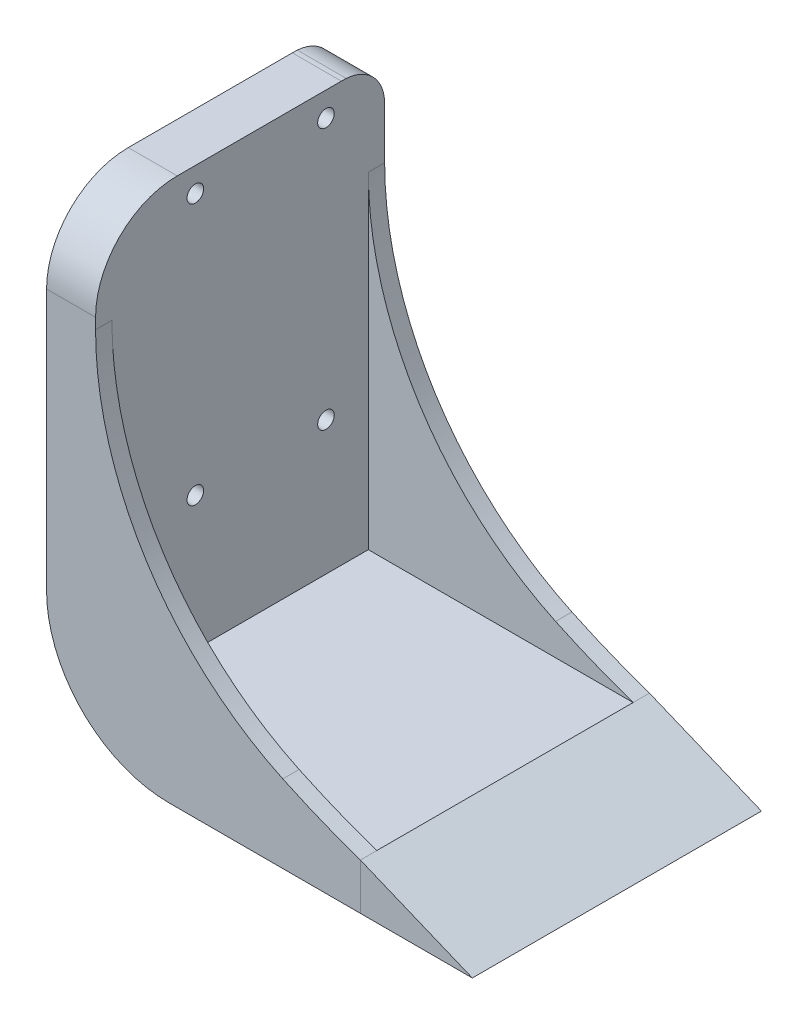
ISO-10303-21;
HEADER;
FILE_DESCRIPTION(('STEP AP214'),'2;1');
FILE_NAME('part.step','',(''),(''),'','','');
FILE_SCHEMA(('AUTOMOTIVE_DESIGN { 1 0 10303 214 1 1 1 1 }'));
ENDSEC;
DATA;
#1=APPLICATION_CONTEXT('core data for automotive mechanical design processes');
#2=APPLICATION_PROTOCOL_DEFINITION('international standard','automotive_design',2000,#1);
#3=PRODUCT_CONTEXT('',#1,'mechanical');
#4=PRODUCT('Part','Part','',(#3));
#5=PRODUCT_RELATED_PRODUCT_CATEGORY('part','',(#4));
#6=PRODUCT_DEFINITION_FORMATION('','',#4);
#7=PRODUCT_DEFINITION_CONTEXT('part definition',#1,'design');
#8=PRODUCT_DEFINITION('design','',#6,#7);
#9=PRODUCT_DEFINITION_SHAPE('','',#8);
#10=(LENGTH_UNIT() NAMED_UNIT(*) SI_UNIT(.MILLI.,.METRE.));
#11=(NAMED_UNIT(*) PLANE_ANGLE_UNIT() SI_UNIT($,.RADIAN.));
#12=(NAMED_UNIT(*) SI_UNIT($,.STERADIAN.) SOLID_ANGLE_UNIT());
#13=UNCERTAINTY_MEASURE_WITH_UNIT(LENGTH_MEASURE(1.E-05),#10,'distance_accuracy_value','');
#14=(GEOMETRIC_REPRESENTATION_CONTEXT(3) GLOBAL_UNCERTAINTY_ASSIGNED_CONTEXT((#13)) GLOBAL_UNIT_ASSIGNED_CONTEXT((#10,
#11,#12)) REPRESENTATION_CONTEXT('',''));
#15=CARTESIAN_POINT('',(0.,0.,0.));
#16=DIRECTION('',(0.,0.,1.));
#17=DIRECTION('',(1.,0.,0.));
#18=AXIS2_PLACEMENT_3D('',#15,#16,#17);
#19=CARTESIAN_POINT('',(38.4306769759206,14.1550631014392,0.0950000000000048));
#20=DIRECTION('',(-1.,0.,0.));
#21=DIRECTION('',(0.,0.,1.));
#22=AXIS2_PLACEMENT_3D('',#19,#20,#21);
#23=PLANE('',#22);
#24=DIRECTION('',(0.,0.,1.));
#25=VECTOR('',#24,1.);
#26=CARTESIAN_POINT('',(38.4306769759206,14.1550631014392,0.0950000000000048));
#27=LINE('',#26,#25);
#28=CARTESIAN_POINT('',(38.4306769759206,14.1550631014392,4.69256326405334));
#29=VERTEX_POINT('',#28);
#30=CARTESIAN_POINT('',(38.4306769759206,14.1550631014392,40.1));
#31=VERTEX_POINT('',#30);
#32=EDGE_CURVE('E12',#29,#31,#27,.T.);
#33=ORIENTED_EDGE('',*,*,#32,.F.);
#34=DIRECTION('',(0.,-1.,0.));
#35=VECTOR('',#34,1.);
#36=CARTESIAN_POINT('',(38.4306769759206,14.1550631014392,4.69256326405334));
#37=LINE('',#36,#35);
#38=CARTESIAN_POINT('',(38.4306769759206,8.49999999999999,4.69256326405334));
#39=VERTEX_POINT('',#38);
#40=EDGE_CURVE('E79',#29,#39,#37,.T.);
#41=ORIENTED_EDGE('',*,*,#40,.T.);
#42=DIRECTION('',(0.,0.,1.));
#43=VECTOR('',#42,1.);
#44=CARTESIAN_POINT('',(38.4306769759206,8.5,0.0950000000000048));
#45=LINE('',#44,#43);
#46=CARTESIAN_POINT('',(38.4306769759206,8.5,40.1));
#47=VERTEX_POINT('',#46);
#48=EDGE_CURVE('E47',#39,#47,#45,.T.);
#49=ORIENTED_EDGE('',*,*,#48,.T.);
#50=DIRECTION('',(0.,-1.,0.));
#51=VECTOR('',#50,1.);
#52=CARTESIAN_POINT('',(38.4306769759206,14.1550631014392,40.1));
#53=LINE('',#52,#51);
#54=EDGE_CURVE('E86',#31,#47,#53,.T.);
#55=ORIENTED_EDGE('',*,*,#54,.F.);
#56=EDGE_LOOP('',(#33,#41,#49,#55));
#57=FACE_BOUND('',#56,.T.);
#58=ADVANCED_FACE('F44',(#57),#23,.T.);
#59=CARTESIAN_POINT('',(52.1466769759206,8.5,0.0950000000000048));
#60=DIRECTION('',(0.381170386169912,0.924504806210914,0.));
#61=DIRECTION('',(-0.924504806210914,0.381170386169913,0.));
#62=AXIS2_PLACEMENT_3D('',#59,#60,#61);
#63=PLANE('',#62);
#64=DIRECTION('',(0.,0.,1.));
#65=VECTOR('',#64,1.);
#66=CARTESIAN_POINT('',(52.1466769759206,8.5,0.0950000000000048));
#67=LINE('',#66,#65);
#68=CARTESIAN_POINT('',(52.1466769759206,8.5,4.69256326405334));
#69=VERTEX_POINT('',#68);
#70=CARTESIAN_POINT('',(52.1466769759206,8.5,40.1));
#71=VERTEX_POINT('',#70);
#72=EDGE_CURVE('E52',#69,#71,#67,.T.);
#73=ORIENTED_EDGE('',*,*,#72,.F.);
#74=DIRECTION('',(-0.924504806210914,0.381170386169913,0.));
#75=VECTOR('',#74,1.);
#76=CARTESIAN_POINT('',(52.1466769759206,8.5,4.69256326405334));
#77=LINE('',#76,#75);
#78=EDGE_CURVE('E60',#69,#29,#77,.T.);
#79=ORIENTED_EDGE('',*,*,#78,.T.);
#80=ORIENTED_EDGE('',*,*,#32,.T.);
#81=DIRECTION('',(-0.924504806210914,0.381170386169912,0.));
#82=VECTOR('',#81,1.);
#83=CARTESIAN_POINT('',(52.1466769759206,8.5,40.1));
#84=LINE('',#83,#82);
#85=EDGE_CURVE('E92',#71,#31,#84,.T.);
#86=ORIENTED_EDGE('',*,*,#85,.F.);
#87=EDGE_LOOP('',(#73,#79,#80,#86));
#88=FACE_BOUND('',#87,.T.);
#89=ADVANCED_FACE('F99',(#88),#63,.T.);
#90=CARTESIAN_POINT('',(38.4306769759206,8.5,0.0950000000000048));
#91=DIRECTION('',(0.,-1.,0.));
#92=DIRECTION('',(0.,0.,-1.));
#93=AXIS2_PLACEMENT_3D('',#90,#91,#92);
#94=PLANE('',#93);
#95=ORIENTED_EDGE('',*,*,#48,.F.);
#96=DIRECTION('',(-1.,0.,0.));
#97=VECTOR('',#96,1.);
#98=CARTESIAN_POINT('',(67.5465364427197,8.5,4.69256326405334));
#99=LINE('',#98,#97);
#100=EDGE_CURVE('E76',#69,#39,#99,.T.);
#101=ORIENTED_EDGE('',*,*,#100,.F.);
#102=ORIENTED_EDGE('',*,*,#72,.T.);
#103=DIRECTION('',(1.,0.,0.));
#104=VECTOR('',#103,1.);
#105=CARTESIAN_POINT('',(38.4306769759206,8.5,40.1));
#106=LINE('',#105,#104);
#107=EDGE_CURVE('E90',#47,#71,#106,.T.);
#108=ORIENTED_EDGE('',*,*,#107,.F.);
#109=EDGE_LOOP('',(#95,#101,#102,#108));
#110=FACE_BOUND('',#109,.T.);
#111=ADVANCED_FACE('F88',(#110),#94,.T.);
#112=CARTESIAN_POINT('',(0.,0.,40.1));
#113=DIRECTION('',(0.,0.,1.));
#114=DIRECTION('',(1.,0.,0.));
#115=AXIS2_PLACEMENT_3D('',#112,#113,#114);
#116=PLANE('',#115);
#117=ORIENTED_EDGE('',*,*,#54,.T.);
#118=ORIENTED_EDGE('',*,*,#107,.T.);
#119=ORIENTED_EDGE('',*,*,#85,.T.);
#120=EDGE_LOOP('',(#117,#118,#119));
#121=FACE_BOUND('',#120,.T.);
#122=ADVANCED_FACE('F100',(#121),#116,.T.);
#123=CARTESIAN_POINT('',(67.5465364427197,8.5,4.69256326405334));
#124=DIRECTION('',(0.,0.,-1.));
#125=DIRECTION('',(-1.,0.,0.));
#126=AXIS2_PLACEMENT_3D('',#123,#124,#125);
#127=PLANE('',#126);
#128=ORIENTED_EDGE('',*,*,#78,.F.);
#129=ORIENTED_EDGE('',*,*,#100,.T.);
#130=ORIENTED_EDGE('',*,*,#40,.F.);
#131=EDGE_LOOP('',(#128,#129,#130));
#132=FACE_BOUND('',#131,.T.);
#133=ADVANCED_FACE('F78',(#132),#127,.T.);
#134=CLOSED_SHELL('',(#58,#89,#111,#122,#133));
#135=MANIFOLD_SOLID_BREP('B2',#134);
#136=CARTESIAN_POINT('',(6.,65.5066,40.1));
#137=DIRECTION('',(-1.,0.,0.));
#138=DIRECTION('',(0.,-1.,0.));
#139=AXIS2_PLACEMENT_3D('',#136,#137,#138);
#140=PLANE('',#139);
#141=CARTESIAN_POINT('',(6.,62.5286,11.88));
#142=DIRECTION('',(-1.,0.,0.));
#143=DIRECTION('',(0.,-1.,0.));
#144=AXIS2_PLACEMENT_3D('',#141,#142,#143);
#145=CIRCLE('',#144,1.016);
#146=CARTESIAN_POINT('',(6.,61.5126,11.88));
#147=VERTEX_POINT('',#146);
#148=EDGE_CURVE('E802',#147,#147,#145,.T.);
#149=ORIENTED_EDGE('',*,*,#148,.T.);
#150=EDGE_LOOP('',(#149));
#151=FACE_BOUND('',#150,.T.);
#152=CARTESIAN_POINT('',(6.,62.5286,27.88));
#153=DIRECTION('',(-1.,0.,0.));
#154=DIRECTION('',(0.,-1.,0.));
#155=AXIS2_PLACEMENT_3D('',#152,#153,#154);
#156=CIRCLE('',#155,1.016);
#157=CARTESIAN_POINT('',(6.,61.5126,27.88));
#158=VERTEX_POINT('',#157);
#159=EDGE_CURVE('E796',#158,#158,#156,.T.);
#160=ORIENTED_EDGE('',*,*,#159,.T.);
#161=EDGE_LOOP('',(#160));
#162=FACE_BOUND('',#161,.T.);
#163=CARTESIAN_POINT('',(6.,30.5286,11.88));
#164=DIRECTION('',(-1.,0.,0.));
#165=DIRECTION('',(0.,-1.,0.));
#166=AXIS2_PLACEMENT_3D('',#163,#164,#165);
#167=CIRCLE('',#166,1.016);
#168=CARTESIAN_POINT('',(6.,29.5126,11.88));
#169=VERTEX_POINT('',#168);
#170=EDGE_CURVE('E790',#169,#169,#167,.T.);
#171=ORIENTED_EDGE('',*,*,#170,.T.);
#172=EDGE_LOOP('',(#171));
#173=FACE_BOUND('',#172,.T.);
#174=CARTESIAN_POINT('',(6.,30.5286,27.88));
#175=DIRECTION('',(-1.,0.,0.));
#176=DIRECTION('',(0.,-1.,0.));
#177=AXIS2_PLACEMENT_3D('',#174,#175,#176);
#178=CIRCLE('',#177,1.016);
#179=CARTESIAN_POINT('',(6.,29.5126,27.88));
#180=VERTEX_POINT('',#179);
#181=EDGE_CURVE('E462',#180,#180,#178,.T.);
#182=ORIENTED_EDGE('',*,*,#181,.T.);
#183=EDGE_LOOP('',(#182));
#184=FACE_BOUND('',#183,.T.);
#185=DIRECTION('',(0.,-1.,0.));
#186=VECTOR('',#185,1.);
#187=CARTESIAN_POINT('',(6.00000000000001,33.5,6.69256326405334));
#188=LINE('',#187,#186);
#189=CARTESIAN_POINT('',(6.00000000000001,54.189933640583,6.69256326405334));
#190=VERTEX_POINT('',#189);
#191=CARTESIAN_POINT('',(6.00000000000001,14.1550631014393,6.69256326405334));
#192=VERTEX_POINT('',#191);
#193=EDGE_CURVE('E515',#190,#192,#188,.T.);
#194=ORIENTED_EDGE('',*,*,#193,.F.);
#195=DIRECTION('',(0.,0.,1.));
#196=VECTOR('',#195,1.);
#197=CARTESIAN_POINT('',(6.,54.189933640583,4.69256326405334));
#198=LINE('',#197,#196);
#199=CARTESIAN_POINT('',(6.,54.189933640583,4.69256326405334));
#200=VERTEX_POINT('',#199);
#201=EDGE_CURVE('E298',#190,#200,#198,.F.);
#202=ORIENTED_EDGE('',*,*,#201,.T.);
#203=DIRECTION('',(0.,-1.,0.));
#204=VECTOR('',#203,1.);
#205=CARTESIAN_POINT('',(6.,65.5066,4.69256326405334));
#206=LINE('',#205,#204);
#207=CARTESIAN_POINT('',(6.,60.4971393148828,4.69256326405334));
#208=VERTEX_POINT('',#207);
#209=EDGE_CURVE('E502',#208,#200,#206,.T.);
#210=ORIENTED_EDGE('',*,*,#209,.F.);
#211=CARTESIAN_POINT('',(6.,60.4971393148828,9.69256326405334));
#212=DIRECTION('',(-1.,0.,0.));
#213=DIRECTION('',(0.,-1.,0.));
#214=AXIS2_PLACEMENT_3D('',#211,#212,#213);
#215=CIRCLE('',#214,5.);
#216=CARTESIAN_POINT('',(6.,65.4876786297655,9.38512652810668));
#217=VERTEX_POINT('',#216);
#218=EDGE_CURVE('E305',#208,#217,#215,.F.);
#219=ORIENTED_EDGE('',*,*,#218,.T.);
#220=CARTESIAN_POINT('',(6.,55.5066,10.));
#221=DIRECTION('',(-1.,0.,0.));
#222=DIRECTION('',(0.,-1.,0.));
#223=AXIS2_PLACEMENT_3D('',#220,#221,#222);
#224=CIRCLE('',#223,10.);
#225=CARTESIAN_POINT('',(6.,65.5066,10.));
#226=VERTEX_POINT('',#225);
#227=EDGE_CURVE('E386',#217,#226,#224,.F.);
#228=ORIENTED_EDGE('',*,*,#227,.T.);
#229=DIRECTION('',(0.,0.,-1.));
#230=VECTOR('',#229,1.);
#231=CARTESIAN_POINT('',(6.,65.5066,40.1));
#232=LINE('',#231,#230);
#233=CARTESIAN_POINT('',(6.,65.5066,30.1));
#234=VERTEX_POINT('',#233);
#235=EDGE_CURVE('E460',#234,#226,#232,.T.);
#236=ORIENTED_EDGE('',*,*,#235,.F.);
#237=CARTESIAN_POINT('',(6.,55.5066,30.1));
#238=DIRECTION('',(-1.,0.,0.));
#239=DIRECTION('',(0.,-1.,0.));
#240=AXIS2_PLACEMENT_3D('',#237,#238,#239);
#241=CIRCLE('',#240,10.);
#242=CARTESIAN_POINT('',(6.,55.5066,40.1));
#243=VERTEX_POINT('',#242);
#244=EDGE_CURVE('E378',#234,#243,#241,.F.);
#245=ORIENTED_EDGE('',*,*,#244,.T.);
#246=DIRECTION('',(0.,1.,0.));
#247=VECTOR('',#246,1.);
#248=CARTESIAN_POINT('',(6.,65.5066,40.1));
#249=LINE('',#248,#247);
#250=CARTESIAN_POINT('',(6.,54.189933640583,40.1));
#251=VERTEX_POINT('',#250);
#252=EDGE_CURVE('E457',#251,#243,#249,.T.);
#253=ORIENTED_EDGE('',*,*,#252,.F.);
#254=DIRECTION('',(0.,0.,1.));
#255=VECTOR('',#254,1.);
#256=CARTESIAN_POINT('',(6.,54.189933640583,40.1));
#257=LINE('',#256,#255);
#258=CARTESIAN_POINT('',(6.00000000000001,54.189933640583,38.1));
#259=VERTEX_POINT('',#258);
#260=EDGE_CURVE('E468',#251,#259,#257,.F.);
#261=ORIENTED_EDGE('',*,*,#260,.T.);
#262=DIRECTION('',(0.,-1.,0.));
#263=VECTOR('',#262,1.);
#264=CARTESIAN_POINT('',(6.00000000000001,33.5,38.1));
#265=LINE('',#264,#263);
#266=CARTESIAN_POINT('',(6.,14.1550631014393,38.1));
#267=VERTEX_POINT('',#266);
#268=EDGE_CURVE('E403',#259,#267,#265,.T.);
#269=ORIENTED_EDGE('',*,*,#268,.T.);
#270=DIRECTION('',(0.,0.,-1.));
#271=VECTOR('',#270,1.);
#272=CARTESIAN_POINT('',(6.,14.1550631014393,40.1));
#273=LINE('',#272,#271);
#274=EDGE_CURVE('E543',#267,#192,#273,.T.);
#275=ORIENTED_EDGE('',*,*,#274,.T.);
#276=EDGE_LOOP('',(#194,#202,#210,#219,#228,#236,#245,#253,#261,#269,#275));
#277=FACE_BOUND('',#276,.T.);
#278=ADVANCED_FACE('F141',(#151,#162,#173,#184,#277),#140,.F.);
#279=CARTESIAN_POINT('',(0.,0.,40.1));
#280=DIRECTION('',(1.,0.,0.));
#281=DIRECTION('',(0.,0.,-1.));
#282=AXIS2_PLACEMENT_3D('',#279,#280,#281);
#283=PLANE('',#282);
#284=CARTESIAN_POINT('',(0.,30.5286,27.88));
#285=DIRECTION('',(-1.,0.,0.));
#286=DIRECTION('',(0.,0.,1.));
#287=AXIS2_PLACEMENT_3D('',#284,#285,#286);
#288=CIRCLE('',#287,1.016);
#289=CARTESIAN_POINT('',(0.,30.5286,28.896));
#290=VERTEX_POINT('',#289);
#291=EDGE_CURVE('E787',#290,#290,#288,.T.);
#292=ORIENTED_EDGE('',*,*,#291,.F.);
#293=EDGE_LOOP('',(#292));
#294=FACE_BOUND('',#293,.T.);
#295=CARTESIAN_POINT('',(0.,30.5286,11.88));
#296=DIRECTION('',(-1.,0.,0.));
#297=DIRECTION('',(0.,0.,-1.));
#298=AXIS2_PLACEMENT_3D('',#295,#296,#297);
#299=CIRCLE('',#298,1.016);
#300=CARTESIAN_POINT('',(0.,30.5286,10.864));
#301=VERTEX_POINT('',#300);
#302=EDGE_CURVE('E793',#301,#301,#299,.T.);
#303=ORIENTED_EDGE('',*,*,#302,.F.);
#304=EDGE_LOOP('',(#303));
#305=FACE_BOUND('',#304,.T.);
#306=CARTESIAN_POINT('',(0.,62.5286,27.88));
#307=DIRECTION('',(-1.,0.,0.));
#308=DIRECTION('',(0.,0.,1.));
#309=AXIS2_PLACEMENT_3D('',#306,#307,#308);
#310=CIRCLE('',#309,1.016);
#311=CARTESIAN_POINT('',(0.,62.5286,28.896));
#312=VERTEX_POINT('',#311);
#313=EDGE_CURVE('E799',#312,#312,#310,.T.);
#314=ORIENTED_EDGE('',*,*,#313,.F.);
#315=EDGE_LOOP('',(#314));
#316=FACE_BOUND('',#315,.T.);
#317=CARTESIAN_POINT('',(0.,62.5286,11.88));
#318=DIRECTION('',(-1.,0.,0.));
#319=DIRECTION('',(0.,0.,-1.));
#320=AXIS2_PLACEMENT_3D('',#317,#318,#319);
#321=CIRCLE('',#320,1.016);
#322=CARTESIAN_POINT('',(0.,62.5286,10.864));
#323=VERTEX_POINT('',#322);
#324=EDGE_CURVE('E402',#323,#323,#321,.T.);
#325=ORIENTED_EDGE('',*,*,#324,.F.);
#326=EDGE_LOOP('',(#325));
#327=FACE_BOUND('',#326,.T.);
#328=CARTESIAN_POINT('',(0.,55.5066,10.));
#329=DIRECTION('',(1.,0.,0.));
#330=DIRECTION('',(0.,0.,-1.));
#331=AXIS2_PLACEMENT_3D('',#328,#329,#330);
#332=CIRCLE('',#331,10.);
#333=CARTESIAN_POINT('',(0.,65.5066,10.));
#334=VERTEX_POINT('',#333);
#335=CARTESIAN_POINT('',(0.,65.4876786297655,9.38512652810668));
#336=VERTEX_POINT('',#335);
#337=EDGE_CURVE('E480',#334,#336,#332,.F.);
#338=ORIENTED_EDGE('',*,*,#337,.T.);
#339=CARTESIAN_POINT('',(0.,60.4971393148828,9.69256326405334));
#340=DIRECTION('',(1.,0.,0.));
#341=DIRECTION('',(0.,0.,-1.));
#342=AXIS2_PLACEMENT_3D('',#339,#340,#341);
#343=CIRCLE('',#342,5.);
#344=CARTESIAN_POINT('',(0.,60.4971393148828,4.69256326405334));
#345=VERTEX_POINT('',#344);
#346=EDGE_CURVE('E495',#336,#345,#343,.F.);
#347=ORIENTED_EDGE('',*,*,#346,.T.);
#348=DIRECTION('',(0.,1.,0.));
#349=VECTOR('',#348,1.);
#350=CARTESIAN_POINT('',(0.,0.,4.69256326405334));
#351=LINE('',#350,#349);
#352=CARTESIAN_POINT('',(0.,23.5,4.69256326405334));
#353=VERTEX_POINT('',#352);
#354=EDGE_CURVE('E504',#353,#345,#351,.T.);
#355=ORIENTED_EDGE('',*,*,#354,.F.);
#356=DIRECTION('',(0.,0.,1.));
#357=VECTOR('',#356,1.);
#358=CARTESIAN_POINT('',(0.,23.5,40.1));
#359=LINE('',#358,#357);
#360=CARTESIAN_POINT('',(0.,23.5,40.1));
#361=VERTEX_POINT('',#360);
#362=EDGE_CURVE('E388',#353,#361,#359,.T.);
#363=ORIENTED_EDGE('',*,*,#362,.T.);
#364=DIRECTION('',(0.,-1.,0.));
#365=VECTOR('',#364,1.);
#366=CARTESIAN_POINT('',(0.,0.,40.1));
#367=LINE('',#366,#365);
#368=CARTESIAN_POINT('',(0.,55.5066,40.1));
#369=VERTEX_POINT('',#368);
#370=EDGE_CURVE('E451',#369,#361,#367,.T.);
#371=ORIENTED_EDGE('',*,*,#370,.F.);
#372=CARTESIAN_POINT('',(0.,55.5066,30.1));
#373=DIRECTION('',(1.,0.,0.));
#374=DIRECTION('',(0.,0.,-1.));
#375=AXIS2_PLACEMENT_3D('',#372,#373,#374);
#376=CIRCLE('',#375,10.);
#377=CARTESIAN_POINT('',(0.,65.5066,30.1));
#378=VERTEX_POINT('',#377);
#379=EDGE_CURVE('E483',#369,#378,#376,.F.);
#380=ORIENTED_EDGE('',*,*,#379,.T.);
#381=DIRECTION('',(0.,0.,-1.));
#382=VECTOR('',#381,1.);
#383=CARTESIAN_POINT('',(0.,65.5066,40.1));
#384=LINE('',#383,#382);
#385=EDGE_CURVE('E456',#378,#334,#384,.T.);
#386=ORIENTED_EDGE('',*,*,#385,.T.);
#387=EDGE_LOOP('',(#338,#347,#355,#363,#371,#380,#386));
#388=FACE_BOUND('',#387,.T.);
#389=ADVANCED_FACE('F348',(#294,#305,#316,#327,#388),#283,.F.);
#390=CARTESIAN_POINT('',(0.,8.5,0.));
#391=DIRECTION('',(0.,1.,0.));
#392=DIRECTION('',(0.,0.,1.));
#393=AXIS2_PLACEMENT_3D('',#390,#391,#392);
#394=PLANE('',#393);
#395=DIRECTION('',(0.,0.,1.));
#396=VECTOR('',#395,1.);
#397=CARTESIAN_POINT('',(15.,8.5,0.));
#398=LINE('',#397,#396);
#399=CARTESIAN_POINT('',(15.,8.5,40.1));
#400=VERTEX_POINT('',#399);
#401=CARTESIAN_POINT('',(15.0000000000002,8.5,6.69256326405334));
#402=VERTEX_POINT('',#401);
#403=EDGE_CURVE('E285',#400,#402,#398,.F.);
#404=ORIENTED_EDGE('',*,*,#403,.T.);
#405=DIRECTION('',(0.,0.,1.));
#406=VECTOR('',#405,1.);
#407=CARTESIAN_POINT('',(15.0000000000002,8.5,-33.3074367359467));
#408=LINE('',#407,#406);
#409=CARTESIAN_POINT('',(15.0000000000002,8.5,4.69256326405334));
#410=VERTEX_POINT('',#409);
#411=EDGE_CURVE('E278',#410,#402,#408,.T.);
#412=ORIENTED_EDGE('',*,*,#411,.F.);
#413=DIRECTION('',(1.,0.,0.));
#414=VECTOR('',#413,1.);
#415=CARTESIAN_POINT('',(6.00000000000001,8.5,4.69256326405334));
#416=LINE('',#415,#414);
#417=CARTESIAN_POINT('',(52.1466769759206,8.50000000000001,4.69256326405334));
#418=VERTEX_POINT('',#417);
#419=EDGE_CURVE('E507',#410,#418,#416,.T.);
#420=ORIENTED_EDGE('',*,*,#419,.T.);
#421=DIRECTION('',(0.,0.,1.));
#422=VECTOR('',#421,1.);
#423=CARTESIAN_POINT('',(52.1466769759206,8.5,0.100000000000003));
#424=LINE('',#423,#422);
#425=CARTESIAN_POINT('',(52.1466769759206,8.5,6.69256326405334));
#426=VERTEX_POINT('',#425);
#427=EDGE_CURVE('E587',#418,#426,#424,.T.);
#428=ORIENTED_EDGE('',*,*,#427,.T.);
#429=DIRECTION('',(1.,0.,0.));
#430=VECTOR('',#429,1.);
#431=CARTESIAN_POINT('',(67.5465364427197,8.5,6.69256326405334));
#432=LINE('',#431,#430);
#433=CARTESIAN_POINT('',(38.4306769759206,8.5,6.69256326405334));
#434=VERTEX_POINT('',#433);
#435=EDGE_CURVE('E522',#434,#426,#432,.T.);
#436=ORIENTED_EDGE('',*,*,#435,.F.);
#437=DIRECTION('',(0.,0.,1.));
#438=VECTOR('',#437,1.);
#439=CARTESIAN_POINT('',(38.4306769759206,8.5,0.));
#440=LINE('',#439,#438);
#441=CARTESIAN_POINT('',(38.4306769759206,8.5,40.1));
#442=VERTEX_POINT('',#441);
#443=EDGE_CURVE('E385',#434,#442,#440,.T.);
#444=ORIENTED_EDGE('',*,*,#443,.T.);
#445=DIRECTION('',(-1.,0.,0.));
#446=VECTOR('',#445,1.);
#447=CARTESIAN_POINT('',(0.,8.5,40.1));
#448=LINE('',#447,#446);
#449=EDGE_CURVE('E395',#442,#400,#448,.T.);
#450=ORIENTED_EDGE('',*,*,#449,.T.);
#451=EDGE_LOOP('',(#404,#412,#420,#428,#436,#444,#450));
#452=FACE_BOUND('',#451,.T.);
#453=ADVANCED_FACE('F354',(#452),#394,.F.);
#454=CARTESIAN_POINT('',(0.,55.5066,10.));
#455=DIRECTION('',(1.,0.,0.));
#456=DIRECTION('',(0.,0.,-1.));
#457=AXIS2_PLACEMENT_3D('',#454,#455,#456);
#458=CYLINDRICAL_SURFACE('',#457,10.);
#459=ORIENTED_EDGE('',*,*,#227,.F.);
#460=DIRECTION('',(1.,0.,0.));
#461=VECTOR('',#460,1.);
#462=CARTESIAN_POINT('',(0.,65.4876786297655,9.38512652810668));
#463=LINE('',#462,#461);
#464=EDGE_CURVE('E493',#217,#336,#463,.F.);
#465=ORIENTED_EDGE('',*,*,#464,.T.);
#466=ORIENTED_EDGE('',*,*,#337,.F.);
#467=DIRECTION('',(-1.,0.,0.));
#468=VECTOR('',#467,1.);
#469=CARTESIAN_POINT('',(0.,65.5066,10.));
#470=LINE('',#469,#468);
#471=EDGE_CURVE('E485',#226,#334,#470,.T.);
#472=ORIENTED_EDGE('',*,*,#471,.F.);
#473=EDGE_LOOP('',(#459,#465,#466,#472));
#474=FACE_BOUND('',#473,.T.);
#475=ADVANCED_FACE('F331',(#474),#458,.T.);
#476=CARTESIAN_POINT('',(15.,23.5,40.1));
#477=DIRECTION('',(0.,0.,1.));
#478=DIRECTION('',(1.,0.,0.));
#479=AXIS2_PLACEMENT_3D('',#476,#477,#478);
#480=CYLINDRICAL_SURFACE('',#479,15.);
#481=ORIENTED_EDGE('',*,*,#362,.F.);
#482=CARTESIAN_POINT('',(15.,23.5,4.69256326405334));
#483=DIRECTION('',(0.,0.,-1.));
#484=DIRECTION('',(-1.,0.,0.));
#485=AXIS2_PLACEMENT_3D('',#482,#483,#484);
#486=CIRCLE('',#485,15.);
#487=CARTESIAN_POINT('',(6.00000000000001,11.5,4.69256326405334));
#488=VERTEX_POINT('',#487);
#489=EDGE_CURVE('E284',#353,#488,#486,.F.);
#490=ORIENTED_EDGE('',*,*,#489,.T.);
#491=DIRECTION('',(0.,0.,1.));
#492=VECTOR('',#491,1.);
#493=CARTESIAN_POINT('',(6.00000000000001,11.5,40.1));
#494=LINE('',#493,#492);
#495=CARTESIAN_POINT('',(6.00000000000001,11.5,6.69256326405334));
#496=VERTEX_POINT('',#495);
#497=EDGE_CURVE('E270',#488,#496,#494,.T.);
#498=ORIENTED_EDGE('',*,*,#497,.T.);
#499=CARTESIAN_POINT('',(10.2565835097475,9.26975052924226,6.69256326405334));
#500=CARTESIAN_POINT('',(8.00658350974748,10.0197505292423,6.69256326405334));
#501=CARTESIAN_POINT('',(6.00000000000001,11.5,6.69256326405334));
#502=B_SPLINE_CURVE_WITH_KNOTS('',2,(#499,#500,#501),.UNSPECIFIED.,.F.,.F.,(3,3),
(0.499999999999989,1.),.UNSPECIFIED.);
#503=CARTESIAN_POINT('',(10.2565835097475,9.26975052924225,6.69256326405334));
#504=VERTEX_POINT('',#503);
#505=EDGE_CURVE('E266',#504,#496,#502,.T.);
#506=ORIENTED_EDGE('',*,*,#505,.F.);
#507=CARTESIAN_POINT('',(15.,8.5,6.69256326405334));
#508=CARTESIAN_POINT('',(12.5065835097475,8.51975052924229,6.69256326405334));
#509=CARTESIAN_POINT('',(10.2565835097475,9.26975052924226,6.69256326405334));
#510=B_SPLINE_CURVE_WITH_KNOTS('',2,(#507,#508,#509),.UNSPECIFIED.,.F.,.F.,(3,3),(0.,
0.499999999999989),.UNSPECIFIED.);
#511=EDGE_CURVE('E273',#402,#504,#510,.T.);
#512=ORIENTED_EDGE('',*,*,#511,.F.);
#513=ORIENTED_EDGE('',*,*,#403,.F.);
#514=CARTESIAN_POINT('',(15.,23.5,40.1));
#515=DIRECTION('',(0.,0.,-1.));
#516=DIRECTION('',(-1.,0.,0.));
#517=AXIS2_PLACEMENT_3D('',#514,#515,#516);
#518=CIRCLE('',#517,15.);
#519=EDGE_CURVE('E289',#361,#400,#518,.F.);
#520=ORIENTED_EDGE('',*,*,#519,.F.);
#521=EDGE_LOOP('',(#481,#490,#498,#506,#512,#513,#520));
#522=FACE_BOUND('',#521,.T.);
#523=ADVANCED_FACE('F283',(#522),#480,.T.);
#524=CARTESIAN_POINT('',(0.,65.5066,40.1));
#525=DIRECTION('',(0.,-1.,0.));
#526=DIRECTION('',(0.,0.,-1.));
#527=AXIS2_PLACEMENT_3D('',#524,#525,#526);
#528=PLANE('',#527);
#529=ORIENTED_EDGE('',*,*,#385,.F.);
#530=DIRECTION('',(-1.,0.,0.));
#531=VECTOR('',#530,1.);
#532=CARTESIAN_POINT('',(0.,65.5066,30.1));
#533=LINE('',#532,#531);
#534=EDGE_CURVE('E379',#378,#234,#533,.F.);
#535=ORIENTED_EDGE('',*,*,#534,.T.);
#536=ORIENTED_EDGE('',*,*,#235,.T.);
#537=ORIENTED_EDGE('',*,*,#471,.T.);
#538=EDGE_LOOP('',(#529,#535,#536,#537));
#539=FACE_BOUND('',#538,.T.);
#540=ADVANCED_FACE('F330',(#539),#528,.F.);
#541=CARTESIAN_POINT('',(0.,0.,40.1));
#542=DIRECTION('',(0.,0.,-1.));
#543=DIRECTION('',(-1.,0.,0.));
#544=AXIS2_PLACEMENT_3D('',#541,#542,#543);
#545=PLANE('',#544);
#546=ORIENTED_EDGE('',*,*,#370,.T.);
#547=ORIENTED_EDGE('',*,*,#519,.T.);
#548=ORIENTED_EDGE('',*,*,#449,.F.);
#549=DIRECTION('',(0.,1.,0.));
#550=VECTOR('',#549,1.);
#551=CARTESIAN_POINT('',(38.4306769759206,8.5,40.1));
#552=LINE('',#551,#550);
#553=CARTESIAN_POINT('',(38.4306769759206,14.1550631014392,40.1));
#554=VERTEX_POINT('',#553);
#555=EDGE_CURVE('E396',#442,#554,#552,.T.);
#556=ORIENTED_EDGE('',*,*,#555,.T.);
#557=CARTESIAN_POINT('',(67.5465364427197,8.5,40.1));
#558=CARTESIAN_POINT('',(30.4515973494541,10.92406083954,40.1));
#559=CARTESIAN_POINT('',(6.00000000000001,33.5,40.1));
#560=B_SPLINE_CURVE_WITH_KNOTS('',2,(#557,#558,#559),.UNSPECIFIED.,.F.,.F.,(3,3),(0.,1.),.UNSPECIFIED.);
#561=CARTESIAN_POINT('',(28.9335995342229,18.0134499095496,40.1));
#562=VERTEX_POINT('',#561);
#563=EDGE_CURVE('E411',#554,#562,#560,.T.);
#564=ORIENTED_EDGE('',*,*,#563,.T.);
#565=CARTESIAN_POINT('',(46.,54.189933640583,40.1));
#566=DIRECTION('',(0.,0.,-1.));
#567=DIRECTION('',(-1.,0.,0.));
#568=AXIS2_PLACEMENT_3D('',#565,#566,#567);
#569=CIRCLE('',#568,40.);
#570=EDGE_CURVE('E474',#562,#251,#569,.T.);
#571=ORIENTED_EDGE('',*,*,#570,.T.);
#572=ORIENTED_EDGE('',*,*,#252,.T.);
#573=DIRECTION('',(-1.,0.,0.));
#574=VECTOR('',#573,1.);
#575=CARTESIAN_POINT('',(0.,55.5066,40.1));
#576=LINE('',#575,#574);
#577=EDGE_CURVE('E381',#243,#369,#576,.T.);
#578=ORIENTED_EDGE('',*,*,#577,.T.);
#579=EDGE_LOOP('',(#546,#547,#548,#556,#564,#571,#572,#578));
#580=FACE_BOUND('',#579,.T.);
#581=ADVANCED_FACE('F441',(#580),#545,.F.);
#582=CARTESIAN_POINT('',(50.8,30.5286,27.88));
#583=DIRECTION('',(-1.,0.,0.));
#584=DIRECTION('',(0.,0.,1.));
#585=AXIS2_PLACEMENT_3D('',#582,#583,#584);
#586=CYLINDRICAL_SURFACE('',#585,1.016);
#587=ORIENTED_EDGE('',*,*,#291,.T.);
#588=EDGE_LOOP('',(#587));
#589=FACE_BOUND('',#588,.T.);
#590=ORIENTED_EDGE('',*,*,#181,.F.);
#591=EDGE_LOOP('',(#590));
#592=FACE_BOUND('',#591,.T.);
#593=ADVANCED_FACE('F437',(#589,#592),#586,.F.);
#594=CARTESIAN_POINT('',(50.8,30.5286,11.88));
#595=DIRECTION('',(-1.,0.,0.));
#596=DIRECTION('',(0.,0.,1.));
#597=AXIS2_PLACEMENT_3D('',#594,#595,#596);
#598=CYLINDRICAL_SURFACE('',#597,1.016);
#599=ORIENTED_EDGE('',*,*,#302,.T.);
#600=EDGE_LOOP('',(#599));
#601=FACE_BOUND('',#600,.T.);
#602=ORIENTED_EDGE('',*,*,#170,.F.);
#603=EDGE_LOOP('',(#602));
#604=FACE_BOUND('',#603,.T.);
#605=ADVANCED_FACE('F433',(#601,#604),#598,.F.);
#606=CARTESIAN_POINT('',(50.8,62.5286,27.88));
#607=DIRECTION('',(-1.,0.,0.));
#608=DIRECTION('',(0.,0.,1.));
#609=AXIS2_PLACEMENT_3D('',#606,#607,#608);
#610=CYLINDRICAL_SURFACE('',#609,1.016);
#611=ORIENTED_EDGE('',*,*,#313,.T.);
#612=EDGE_LOOP('',(#611));
#613=FACE_BOUND('',#612,.T.);
#614=ORIENTED_EDGE('',*,*,#159,.F.);
#615=EDGE_LOOP('',(#614));
#616=FACE_BOUND('',#615,.T.);
#617=ADVANCED_FACE('F429',(#613,#616),#610,.F.);
#618=CARTESIAN_POINT('',(50.8,62.5286,11.88));
#619=DIRECTION('',(-1.,0.,0.));
#620=DIRECTION('',(0.,0.,1.));
#621=AXIS2_PLACEMENT_3D('',#618,#619,#620);
#622=CYLINDRICAL_SURFACE('',#621,1.016);
#623=ORIENTED_EDGE('',*,*,#324,.T.);
#624=EDGE_LOOP('',(#623));
#625=FACE_BOUND('',#624,.T.);
#626=ORIENTED_EDGE('',*,*,#148,.F.);
#627=EDGE_LOOP('',(#626));
#628=FACE_BOUND('',#627,.T.);
#629=ADVANCED_FACE('F424',(#625,#628),#622,.F.);
#630=CARTESIAN_POINT('',(67.5465364427197,8.5,38.1));
#631=CARTESIAN_POINT('',(30.4515973494541,10.92406083954,38.1));
#632=CARTESIAN_POINT('',(6.00000000000001,33.5,38.1));
#633=B_SPLINE_CURVE_WITH_KNOTS('',2,(#630,#631,#632),.UNSPECIFIED.,.F.,.F.,(3,3),(0.,1.),.UNSPECIFIED.);
#634=DIRECTION('',(0.,0.,1.));
#635=VECTOR('',#634,1.);
#636=SURFACE_OF_LINEAR_EXTRUSION('',#633,#635);
#637=DIRECTION('',(0.,0.,1.));
#638=VECTOR('',#637,1.);
#639=CARTESIAN_POINT('',(38.4306769759206,14.1550631014391,38.1));
#640=LINE('',#639,#638);
#641=CARTESIAN_POINT('',(38.4306769759206,14.1550631014393,38.1));
#642=VERTEX_POINT('',#641);
#643=EDGE_CURVE('E393',#642,#554,#640,.T.);
#644=ORIENTED_EDGE('',*,*,#643,.F.);
#645=CARTESIAN_POINT('',(28.9335995342229,18.0134499095496,38.1));
#646=VERTEX_POINT('',#645);
#647=EDGE_CURVE('E399',#642,#646,#633,.T.);
#648=ORIENTED_EDGE('',*,*,#647,.T.);
#649=DIRECTION('',(0.,0.,1.));
#650=VECTOR('',#649,1.);
#651=CARTESIAN_POINT('',(28.9335995342228,18.0134499095497,38.1));
#652=LINE('',#651,#650);
#653=EDGE_CURVE('E471',#646,#562,#652,.T.);
#654=ORIENTED_EDGE('',*,*,#653,.T.);
#655=ORIENTED_EDGE('',*,*,#563,.F.);
#656=EDGE_LOOP('',(#644,#648,#654,#655));
#657=FACE_BOUND('',#656,.T.);
#658=ADVANCED_FACE('F420',(#657),#636,.T.);
#659=CARTESIAN_POINT('',(33.612432785407,15.96203041977,38.1));
#660=DIRECTION('',(0.,0.,-1.));
#661=DIRECTION('',(-1.,0.,0.));
#662=AXIS2_PLACEMENT_3D('',#659,#660,#661);
#663=PLANE('',#662);
#664=DIRECTION('',(1.,0.,0.));
#665=VECTOR('',#664,1.);
#666=CARTESIAN_POINT('',(33.612432785407,14.1550631014393,38.1));
#667=LINE('',#666,#665);
#668=EDGE_CURVE('E551',#267,#642,#667,.T.);
#669=ORIENTED_EDGE('',*,*,#668,.F.);
#670=ORIENTED_EDGE('',*,*,#268,.F.);
#671=CARTESIAN_POINT('',(46.,54.189933640583,38.1));
#672=DIRECTION('',(0.,0.,-1.));
#673=DIRECTION('',(-1.,0.,0.));
#674=AXIS2_PLACEMENT_3D('',#671,#672,#673);
#675=CIRCLE('',#674,40.);
#676=EDGE_CURVE('E476',#259,#646,#675,.F.);
#677=ORIENTED_EDGE('',*,*,#676,.T.);
#678=ORIENTED_EDGE('',*,*,#647,.F.);
#679=EDGE_LOOP('',(#669,#670,#677,#678));
#680=FACE_BOUND('',#679,.T.);
#681=ADVANCED_FACE('F364',(#680),#663,.T.);
#682=CARTESIAN_POINT('',(46.,54.189933640583,39.1));
#683=DIRECTION('',(0.,0.,1.));
#684=DIRECTION('',(1.,0.,0.));
#685=AXIS2_PLACEMENT_3D('',#682,#683,#684);
#686=CYLINDRICAL_SURFACE('',#685,40.);
#687=ORIENTED_EDGE('',*,*,#676,.F.);
#688=ORIENTED_EDGE('',*,*,#260,.F.);
#689=ORIENTED_EDGE('',*,*,#570,.F.);
#690=ORIENTED_EDGE('',*,*,#653,.F.);
#691=EDGE_LOOP('',(#687,#688,#689,#690));
#692=FACE_BOUND('',#691,.T.);
#693=ADVANCED_FACE('F361',(#692),#686,.F.);
#694=CARTESIAN_POINT('',(0.,55.5066,30.1));
#695=DIRECTION('',(-1.,0.,0.));
#696=DIRECTION('',(0.,0.,1.));
#697=AXIS2_PLACEMENT_3D('',#694,#695,#696);
#698=CYLINDRICAL_SURFACE('',#697,10.);
#699=ORIENTED_EDGE('',*,*,#244,.F.);
#700=ORIENTED_EDGE('',*,*,#534,.F.);
#701=ORIENTED_EDGE('',*,*,#379,.F.);
#702=ORIENTED_EDGE('',*,*,#577,.F.);
#703=EDGE_LOOP('',(#699,#700,#701,#702));
#704=FACE_BOUND('',#703,.T.);
#705=ADVANCED_FACE('F363',(#704),#698,.T.);
#706=CARTESIAN_POINT('',(38.4306769759206,8.5,40.1));
#707=DIRECTION('',(-1.,0.,0.));
#708=DIRECTION('',(0.,0.,1.));
#709=AXIS2_PLACEMENT_3D('',#706,#707,#708);
#710=PLANE('',#709);
#711=ORIENTED_EDGE('',*,*,#443,.F.);
#712=DIRECTION('',(0.,1.,0.));
#713=VECTOR('',#712,1.);
#714=CARTESIAN_POINT('',(38.4306769759206,8.5,6.69256326405334));
#715=LINE('',#714,#713);
#716=CARTESIAN_POINT('',(38.4306769759206,14.1550631014392,6.69256326405334));
#717=VERTEX_POINT('',#716);
#718=EDGE_CURVE('E544',#434,#717,#715,.T.);
#719=ORIENTED_EDGE('',*,*,#718,.T.);
#720=DIRECTION('',(0.,0.,1.));
#721=VECTOR('',#720,1.);
#722=CARTESIAN_POINT('',(38.4306769759206,14.1550631014393,0.100000000000003));
#723=LINE('',#722,#721);
#724=EDGE_CURVE('E541',#717,#642,#723,.T.);
#725=ORIENTED_EDGE('',*,*,#724,.T.);
#726=ORIENTED_EDGE('',*,*,#643,.T.);
#727=ORIENTED_EDGE('',*,*,#555,.F.);
#728=EDGE_LOOP('',(#711,#719,#725,#726,#727));
#729=FACE_BOUND('',#728,.T.);
#730=ADVANCED_FACE('F367',(#729),#710,.F.);
#731=CARTESIAN_POINT('',(38.4306769759206,14.1550631014393,0.100000000000003));
#732=DIRECTION('',(0.,1.,0.));
#733=DIRECTION('',(0.,0.,1.));
#734=AXIS2_PLACEMENT_3D('',#731,#732,#733);
#735=PLANE('',#734);
#736=DIRECTION('',(1.,0.,0.));
#737=VECTOR('',#736,1.);
#738=CARTESIAN_POINT('',(38.4306769759206,14.1550631014393,6.69256326405334));
#739=LINE('',#738,#737);
#740=EDGE_CURVE('E576',#192,#717,#739,.T.);
#741=ORIENTED_EDGE('',*,*,#740,.F.);
#742=ORIENTED_EDGE('',*,*,#274,.F.);
#743=ORIENTED_EDGE('',*,*,#668,.T.);
#744=ORIENTED_EDGE('',*,*,#724,.F.);
#745=EDGE_LOOP('',(#741,#742,#743,#744));
#746=FACE_BOUND('',#745,.T.);
#747=ADVANCED_FACE('F372',(#746),#735,.T.);
#748=CARTESIAN_POINT('',(67.5465364427197,8.5,6.69256326405334));
#749=CARTESIAN_POINT('',(30.4515973494541,10.92406083954,6.69256326405334));
#750=CARTESIAN_POINT('',(6.00000000000001,33.5,6.69256326405334));
#751=B_SPLINE_CURVE_WITH_KNOTS('',2,(#748,#749,#750),.UNSPECIFIED.,.F.,.F.,(3,3),(0.,1.),.UNSPECIFIED.);
#752=DIRECTION('',(0.,0.,-1.));
#753=VECTOR('',#752,1.);
#754=SURFACE_OF_LINEAR_EXTRUSION('',#751,#753);
#755=CARTESIAN_POINT('',(67.5465364427197,8.5,4.69256326405334));
#756=CARTESIAN_POINT('',(30.4515973494541,10.92406083954,4.69256326405334));
#757=CARTESIAN_POINT('',(6.00000000000001,33.5,4.69256326405334));
#758=B_SPLINE_CURVE_WITH_KNOTS('',2,(#755,#756,#757),.UNSPECIFIED.,.F.,.F.,(3,3),(0.,1.),.UNSPECIFIED.);
#759=CARTESIAN_POINT('',(38.4306769759206,14.1550631014392,4.69256326405334));
#760=VERTEX_POINT('',#759);
#761=CARTESIAN_POINT('',(28.9335995342229,18.0134499095496,4.69256326405334));
#762=VERTEX_POINT('',#761);
#763=EDGE_CURVE('E505',#760,#762,#758,.T.);
#764=ORIENTED_EDGE('',*,*,#763,.T.);
#765=DIRECTION('',(0.,0.,-1.));
#766=VECTOR('',#765,1.);
#767=CARTESIAN_POINT('',(28.9335995342228,18.0134499095497,4.69256326405334));
#768=LINE('',#767,#766);
#769=CARTESIAN_POINT('',(28.9335995342229,18.0134499095496,6.69256326405334));
#770=VERTEX_POINT('',#769);
#771=EDGE_CURVE('E162',#762,#770,#768,.F.);
#772=ORIENTED_EDGE('',*,*,#771,.T.);
#773=EDGE_CURVE('E517',#717,#770,#751,.T.);
#774=ORIENTED_EDGE('',*,*,#773,.F.);
#775=DIRECTION('',(0.,0.,1.));
#776=VECTOR('',#775,1.);
#777=CARTESIAN_POINT('',(38.4306769759206,14.1550631014392,0.100000000000003));
#778=LINE('',#777,#776);
#779=EDGE_CURVE('E277',#760,#717,#778,.T.);
#780=ORIENTED_EDGE('',*,*,#779,.F.);
#781=EDGE_LOOP('',(#764,#772,#774,#780));
#782=FACE_BOUND('',#781,.T.);
#783=ADVANCED_FACE('F527',(#782),#754,.F.);
#784=CARTESIAN_POINT('',(33.612432785407,15.96203041977,6.69256326405334));
#785=DIRECTION('',(0.,0.,1.));
#786=DIRECTION('',(-1.,0.,0.));
#787=AXIS2_PLACEMENT_3D('',#784,#785,#786);
#788=PLANE('',#787);
#789=DIRECTION('',(0.924504806210914,-0.381170386169912,0.));
#790=VECTOR('',#789,1.);
#791=CARTESIAN_POINT('',(33.6757154660453,16.1155185828667,6.69256326405334));
#792=LINE('',#791,#790);
#793=EDGE_CURVE('E512',#717,#426,#792,.T.);
#794=ORIENTED_EDGE('',*,*,#793,.F.);
#795=ORIENTED_EDGE('',*,*,#718,.F.);
#796=ORIENTED_EDGE('',*,*,#435,.T.);
#797=EDGE_LOOP('',(#794,#795,#796));
#798=FACE_BOUND('',#797,.T.);
#799=ADVANCED_FACE('F531',(#798),#788,.T.);
#800=ORIENTED_EDGE('',*,*,#193,.T.);
#801=ORIENTED_EDGE('',*,*,#740,.T.);
#802=ORIENTED_EDGE('',*,*,#773,.T.);
#803=CARTESIAN_POINT('',(46.,54.189933640583,6.69256326405334));
#804=DIRECTION('',(0.,0.,1.));
#805=DIRECTION('',(1.,0.,0.));
#806=AXIS2_PLACEMENT_3D('',#803,#804,#805);
#807=CIRCLE('',#806,40.);
#808=EDGE_CURVE('E42',#770,#190,#807,.F.);
#809=ORIENTED_EDGE('',*,*,#808,.T.);
#810=EDGE_LOOP('',(#800,#801,#802,#809));
#811=FACE_BOUND('',#810,.T.);
#812=ADVANCED_FACE('F592',(#811),#788,.T.);
#813=CARTESIAN_POINT('',(33.612432785407,15.96203041977,4.69256326405334));
#814=DIRECTION('',(0.,0.,1.));
#815=DIRECTION('',(-1.,0.,0.));
#816=AXIS2_PLACEMENT_3D('',#813,#814,#815);
#817=PLANE('',#816);
#818=ORIENTED_EDGE('',*,*,#419,.F.);
#819=CARTESIAN_POINT('',(15.,8.5,4.69256326405334));
#820=CARTESIAN_POINT('',(10.0131670194949,8.53950105848459,4.69256326405334));
#821=CARTESIAN_POINT('',(6.00000000000001,11.5,4.69256326405334));
#822=B_SPLINE_CURVE_WITH_KNOTS('',2,(#819,#820,#821),.UNSPECIFIED.,.F.,.F.,(3,3),(0.,1.),.UNSPECIFIED.);
#823=EDGE_CURVE('E301',#410,#488,#822,.T.);
#824=ORIENTED_EDGE('',*,*,#823,.T.);
#825=ORIENTED_EDGE('',*,*,#489,.F.);
#826=ORIENTED_EDGE('',*,*,#354,.T.);
#827=DIRECTION('',(-1.,0.,0.));
#828=VECTOR('',#827,1.);
#829=CARTESIAN_POINT('',(6.,60.4971393148828,4.69256326405334));
#830=LINE('',#829,#828);
#831=EDGE_CURVE('E308',#345,#208,#830,.F.);
#832=ORIENTED_EDGE('',*,*,#831,.T.);
#833=ORIENTED_EDGE('',*,*,#209,.T.);
#834=CARTESIAN_POINT('',(46.,54.189933640583,4.69256326405334));
#835=DIRECTION('',(0.,0.,1.));
#836=DIRECTION('',(1.,0.,0.));
#837=AXIS2_PLACEMENT_3D('',#834,#835,#836);
#838=CIRCLE('',#837,40.);
#839=EDGE_CURVE('E149',#200,#762,#838,.T.);
#840=ORIENTED_EDGE('',*,*,#839,.T.);
#841=ORIENTED_EDGE('',*,*,#763,.F.);
#842=DIRECTION('',(0.924504806210914,-0.381170386169912,0.));
#843=VECTOR('',#842,1.);
#844=CARTESIAN_POINT('',(33.6757154660453,16.1155185828667,4.69256326405334));
#845=LINE('',#844,#843);
#846=EDGE_CURVE('E287',#760,#418,#845,.T.);
#847=ORIENTED_EDGE('',*,*,#846,.T.);
#848=EDGE_LOOP('',(#818,#824,#825,#826,#832,#833,#840,#841,#847));
#849=FACE_BOUND('',#848,.T.);
#850=ADVANCED_FACE('F343',(#849),#817,.F.);
#851=CARTESIAN_POINT('',(38.4306769759206,14.1550631014392,0.100000000000003));
#852=DIRECTION('',(-0.381170386169912,-0.924504806210914,0.));
#853=DIRECTION('',(0.924504806210914,-0.381170386169912,0.));
#854=AXIS2_PLACEMENT_3D('',#851,#852,#853);
#855=PLANE('',#854);
#856=ORIENTED_EDGE('',*,*,#793,.T.);
#857=ORIENTED_EDGE('',*,*,#427,.F.);
#858=ORIENTED_EDGE('',*,*,#846,.F.);
#859=ORIENTED_EDGE('',*,*,#779,.T.);
#860=EDGE_LOOP('',(#856,#857,#858,#859));
#861=FACE_BOUND('',#860,.T.);
#862=ADVANCED_FACE('F336',(#861),#855,.F.);
#863=CARTESIAN_POINT('',(0.,60.4971393148828,9.69256326405334));
#864=DIRECTION('',(1.,0.,0.));
#865=DIRECTION('',(0.,0.,-1.));
#866=AXIS2_PLACEMENT_3D('',#863,#864,#865);
#867=CYLINDRICAL_SURFACE('',#866,5.);
#868=ORIENTED_EDGE('',*,*,#218,.F.);
#869=ORIENTED_EDGE('',*,*,#831,.F.);
#870=ORIENTED_EDGE('',*,*,#346,.F.);
#871=ORIENTED_EDGE('',*,*,#464,.F.);
#872=EDGE_LOOP('',(#868,#869,#870,#871));
#873=FACE_BOUND('',#872,.T.);
#874=ADVANCED_FACE('F333',(#873),#867,.T.);
#875=CARTESIAN_POINT('',(15.,8.5,-33.3074367359467));
#876=CARTESIAN_POINT('',(10.0131670194949,8.53950105848459,-33.3074367359467));
#877=CARTESIAN_POINT('',(6.00000000000001,11.5,-33.3074367359467));
#878=B_SPLINE_CURVE_WITH_KNOTS('',2,(#875,#876,#877),.UNSPECIFIED.,.F.,.F.,(3,3),(0.,1.),.UNSPECIFIED.);
#879=DIRECTION('',(0.,0.,1.));
#880=VECTOR('',#879,1.);
#881=SURFACE_OF_LINEAR_EXTRUSION('',#878,#880);
#882=ORIENTED_EDGE('',*,*,#411,.T.);
#883=ORIENTED_EDGE('',*,*,#511,.T.);
#884=ORIENTED_EDGE('',*,*,#505,.T.);
#885=ORIENTED_EDGE('',*,*,#497,.F.);
#886=ORIENTED_EDGE('',*,*,#823,.F.);
#887=EDGE_LOOP('',(#882,#883,#884,#885,#886));
#888=FACE_BOUND('',#887,.T.);
#889=ADVANCED_FACE('F269',(#888),#881,.F.);
#890=CARTESIAN_POINT('',(46.,54.189933640583,5.69256326405334));
#891=DIRECTION('',(0.,0.,-1.));
#892=DIRECTION('',(-1.,0.,0.));
#893=AXIS2_PLACEMENT_3D('',#890,#891,#892);
#894=CYLINDRICAL_SURFACE('',#893,40.);
#895=ORIENTED_EDGE('',*,*,#808,.F.);
#896=ORIENTED_EDGE('',*,*,#771,.F.);
#897=ORIENTED_EDGE('',*,*,#839,.F.);
#898=ORIENTED_EDGE('',*,*,#201,.F.);
#899=EDGE_LOOP('',(#895,#896,#897,#898));
#900=FACE_BOUND('',#899,.T.);
#901=ADVANCED_FACE('F143',(#900),#894,.F.);
#902=CLOSED_SHELL('',(#278,#389,#453,#475,#523,#540,#581,#593,#605,#617,#629,#658,#681,#693,
#705,#730,#747,#783,#799,#812,#850,#862,#874,#889,#901));
#903=MANIFOLD_SOLID_BREP('B6',#902);
#904=ADVANCED_BREP_SHAPE_REPRESENTATION('',(#18,#135,#903),#14);
#905=SHAPE_DEFINITION_REPRESENTATION(#9,#904);
ENDSEC;
END-ISO-10303-21;
